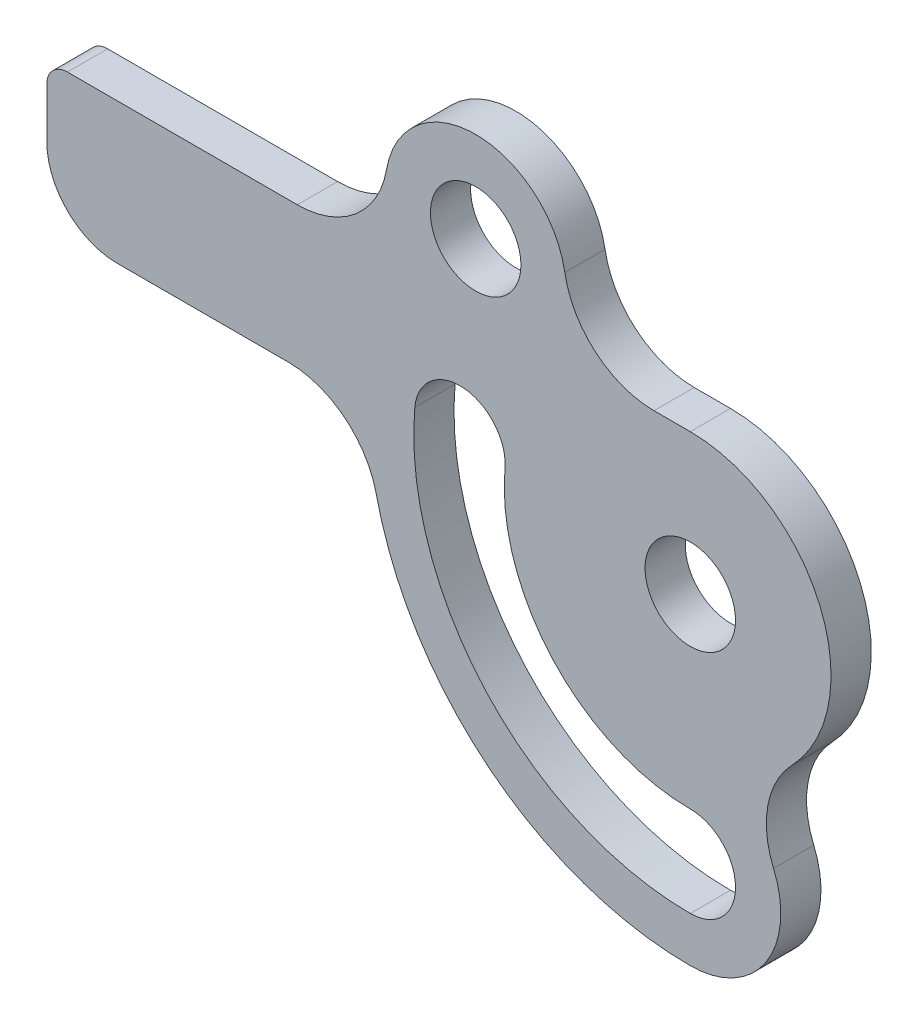
ISO-10303-21;
HEADER;
FILE_DESCRIPTION(('STEP AP214'),'2;1');
FILE_NAME('part.step','',(''),(''),'','','');
FILE_SCHEMA(('AUTOMOTIVE_DESIGN { 1 0 10303 214 1 1 1 1 }'));
ENDSEC;
DATA;
#1=APPLICATION_CONTEXT('core data for automotive mechanical design processes');
#2=APPLICATION_PROTOCOL_DEFINITION('international standard','automotive_design',2000,#1);
#3=PRODUCT_CONTEXT('',#1,'mechanical');
#4=PRODUCT('Part','Part','',(#3));
#5=PRODUCT_RELATED_PRODUCT_CATEGORY('part','',(#4));
#6=PRODUCT_DEFINITION_FORMATION('','',#4);
#7=PRODUCT_DEFINITION_CONTEXT('part definition',#1,'design');
#8=PRODUCT_DEFINITION('design','',#6,#7);
#9=PRODUCT_DEFINITION_SHAPE('','',#8);
#10=(LENGTH_UNIT() NAMED_UNIT(*) SI_UNIT(.MILLI.,.METRE.));
#11=(NAMED_UNIT(*) PLANE_ANGLE_UNIT() SI_UNIT($,.RADIAN.));
#12=(NAMED_UNIT(*) SI_UNIT($,.STERADIAN.) SOLID_ANGLE_UNIT());
#13=UNCERTAINTY_MEASURE_WITH_UNIT(LENGTH_MEASURE(1.E-05),#10,'distance_accuracy_value','');
#14=(GEOMETRIC_REPRESENTATION_CONTEXT(3) GLOBAL_UNCERTAINTY_ASSIGNED_CONTEXT((#13)) GLOBAL_UNIT_ASSIGNED_CONTEXT((#10,
#11,#12)) REPRESENTATION_CONTEXT('',''));
#15=CARTESIAN_POINT('',(0.,0.,0.));
#16=DIRECTION('',(0.,0.,1.));
#17=DIRECTION('',(1.,0.,0.));
#18=AXIS2_PLACEMENT_3D('',#15,#16,#17);
#19=CARTESIAN_POINT('',(25.4,-9.128125,1.5875));
#20=DIRECTION('',(0.,0.,-1.));
#21=DIRECTION('',(-1.,0.,0.));
#22=AXIS2_PLACEMENT_3D('',#19,#20,#21);
#23=CYLINDRICAL_SURFACE('',#22,1.7859375);
#24=CARTESIAN_POINT('',(25.4,-9.128125,0.));
#25=DIRECTION('',(0.,0.,1.));
#26=DIRECTION('',(1.,0.,0.));
#27=AXIS2_PLACEMENT_3D('',#24,#25,#26);
#28=CIRCLE('',#27,1.7859375);
#29=CARTESIAN_POINT('',(25.4,-10.9140625,0.));
#30=VERTEX_POINT('',#29);
#31=CARTESIAN_POINT('',(25.4,-7.34218749999999,0.));
#32=VERTEX_POINT('',#31);
#33=EDGE_CURVE('E283',#30,#32,#28,.T.);
#34=ORIENTED_EDGE('',*,*,#33,.F.);
#35=DIRECTION('',(0.,0.,-1.));
#36=VECTOR('',#35,1.);
#37=CARTESIAN_POINT('',(25.4,-10.9140625,1.5875));
#38=LINE('',#37,#36);
#39=CARTESIAN_POINT('',(25.4,-10.9140625,1.5875));
#40=VERTEX_POINT('',#39);
#41=EDGE_CURVE('E306',#40,#30,#38,.T.);
#42=ORIENTED_EDGE('',*,*,#41,.F.);
#43=CARTESIAN_POINT('',(25.4,-9.128125,1.5875));
#44=DIRECTION('',(0.,0.,1.));
#45=DIRECTION('',(1.,0.,0.));
#46=AXIS2_PLACEMENT_3D('',#43,#44,#45);
#47=CIRCLE('',#46,1.7859375);
#48=CARTESIAN_POINT('',(25.4,-7.34218749999999,1.5875));
#49=VERTEX_POINT('',#48);
#50=EDGE_CURVE('E229',#40,#49,#47,.T.);
#51=ORIENTED_EDGE('',*,*,#50,.T.);
#52=DIRECTION('',(0.,0.,-1.));
#53=VECTOR('',#52,1.);
#54=CARTESIAN_POINT('',(25.4,-7.34218749999999,1.5875));
#55=LINE('',#54,#53);
#56=EDGE_CURVE('E180',#49,#32,#55,.T.);
#57=ORIENTED_EDGE('',*,*,#56,.T.);
#58=EDGE_LOOP('',(#34,#42,#51,#57));
#59=FACE_BOUND('',#58,.T.);
#60=ADVANCED_FACE('F41',(#59),#23,.F.);
#61=CARTESIAN_POINT('',(25.4,0.,1.5875));
#62=DIRECTION('',(0.,0.,-1.));
#63=DIRECTION('',(-1.,0.,0.));
#64=AXIS2_PLACEMENT_3D('',#61,#62,#63);
#65=CYLINDRICAL_SURFACE('',#64,10.9140625);
#66=CARTESIAN_POINT('',(25.4,0.,0.));
#67=DIRECTION('',(0.,0.,1.));
#68=DIRECTION('',(1.,0.,0.));
#69=AXIS2_PLACEMENT_3D('',#66,#67,#68);
#70=CIRCLE('',#69,10.9140625);
#71=CARTESIAN_POINT('',(14.5274688028581,0.951223223581812,0.));
#72=VERTEX_POINT('',#71);
#73=EDGE_CURVE('E287',#30,#72,#70,.F.);
#74=ORIENTED_EDGE('',*,*,#73,.T.);
#75=DIRECTION('',(0.,0.,-1.));
#76=VECTOR('',#75,1.);
#77=CARTESIAN_POINT('',(14.5274688028581,0.951223223581812,1.5875));
#78=LINE('',#77,#76);
#79=CARTESIAN_POINT('',(14.5274688028581,0.951223223581812,1.5875));
#80=VERTEX_POINT('',#79);
#81=EDGE_CURVE('E303',#80,#72,#78,.T.);
#82=ORIENTED_EDGE('',*,*,#81,.F.);
#83=CARTESIAN_POINT('',(25.4,0.,1.5875));
#84=DIRECTION('',(0.,0.,1.));
#85=DIRECTION('',(1.,0.,0.));
#86=AXIS2_PLACEMENT_3D('',#83,#84,#85);
#87=CIRCLE('',#86,10.9140625);
#88=EDGE_CURVE('E233',#40,#80,#87,.F.);
#89=ORIENTED_EDGE('',*,*,#88,.F.);
#90=ORIENTED_EDGE('',*,*,#41,.T.);
#91=EDGE_LOOP('',(#74,#82,#89,#90));
#92=FACE_BOUND('',#91,.T.);
#93=ADVANCED_FACE('F387',(#92),#65,.F.);
#94=CARTESIAN_POINT('',(16.3066102714813,0.795568514268424,1.5875));
#95=DIRECTION('',(0.,0.,-1.));
#96=DIRECTION('',(-1.,0.,0.));
#97=AXIS2_PLACEMENT_3D('',#94,#95,#96);
#98=CYLINDRICAL_SURFACE('',#97,1.78593749999999);
#99=CARTESIAN_POINT('',(16.3066102714813,0.795568514268424,0.));
#100=DIRECTION('',(0.,0.,1.));
#101=DIRECTION('',(1.,0.,0.));
#102=AXIS2_PLACEMENT_3D('',#99,#100,#101);
#103=CIRCLE('',#102,1.78593749999999);
#104=CARTESIAN_POINT('',(18.0857517401045,0.639913804955036,0.));
#105=VERTEX_POINT('',#104);
#106=EDGE_CURVE('E291',#105,#72,#103,.T.);
#107=ORIENTED_EDGE('',*,*,#106,.F.);
#108=DIRECTION('',(0.,0.,-1.));
#109=VECTOR('',#108,1.);
#110=CARTESIAN_POINT('',(18.0857517401045,0.639913804955036,1.5875));
#111=LINE('',#110,#109);
#112=CARTESIAN_POINT('',(18.0857517401045,0.639913804955036,1.5875));
#113=VERTEX_POINT('',#112);
#114=EDGE_CURVE('E300',#113,#105,#111,.T.);
#115=ORIENTED_EDGE('',*,*,#114,.F.);
#116=CARTESIAN_POINT('',(16.3066102714813,0.795568514268424,1.5875));
#117=DIRECTION('',(0.,0.,1.));
#118=DIRECTION('',(1.,0.,0.));
#119=AXIS2_PLACEMENT_3D('',#116,#117,#118);
#120=CIRCLE('',#119,1.78593749999999);
#121=EDGE_CURVE('E236',#113,#80,#120,.T.);
#122=ORIENTED_EDGE('',*,*,#121,.T.);
#123=ORIENTED_EDGE('',*,*,#81,.T.);
#124=EDGE_LOOP('',(#107,#115,#122,#123));
#125=FACE_BOUND('',#124,.T.);
#126=ADVANCED_FACE('F393',(#125),#98,.F.);
#127=CARTESIAN_POINT('',(0.,5.55625,1.5875));
#128=DIRECTION('',(0.,1.,0.));
#129=DIRECTION('',(0.,0.,1.));
#130=AXIS2_PLACEMENT_3D('',#127,#128,#129);
#131=PLANE('',#130);
#132=DIRECTION('',(1.,0.,0.));
#133=VECTOR('',#132,1.);
#134=CARTESIAN_POINT('',(0.,5.55625,1.5875));
#135=LINE('',#134,#133);
#136=CARTESIAN_POINT('',(0.813693973516123,5.55625,1.5875));
#137=VERTEX_POINT('',#136);
#138=CARTESIAN_POINT('',(9.88973119369293,5.55625,1.5875));
#139=VERTEX_POINT('',#138);
#140=EDGE_CURVE('E172',#137,#139,#135,.T.);
#141=ORIENTED_EDGE('',*,*,#140,.T.);
#142=DIRECTION('',(0.,0.,-1.));
#143=VECTOR('',#142,1.);
#144=CARTESIAN_POINT('',(9.88973119369293,5.55625,1.5875));
#145=LINE('',#144,#143);
#146=CARTESIAN_POINT('',(9.88973119369293,5.55625,0.));
#147=VERTEX_POINT('',#146);
#148=EDGE_CURVE('E340',#139,#147,#145,.T.);
#149=ORIENTED_EDGE('',*,*,#148,.T.);
#150=DIRECTION('',(1.,0.,0.));
#151=VECTOR('',#150,1.);
#152=CARTESIAN_POINT('',(0.,5.55625,0.));
#153=LINE('',#152,#151);
#154=CARTESIAN_POINT('',(0.813693973516123,5.55625,0.));
#155=VERTEX_POINT('',#154);
#156=EDGE_CURVE('E175',#155,#147,#153,.T.);
#157=ORIENTED_EDGE('',*,*,#156,.F.);
#158=DIRECTION('',(0.,0.,-1.));
#159=VECTOR('',#158,1.);
#160=CARTESIAN_POINT('',(0.813693973516123,5.55625,1.5875));
#161=LINE('',#160,#159);
#162=EDGE_CURVE('E167',#137,#155,#161,.T.);
#163=ORIENTED_EDGE('',*,*,#162,.F.);
#164=EDGE_LOOP('',(#141,#149,#157,#163));
#165=FACE_BOUND('',#164,.T.);
#166=ADVANCED_FACE('F169',(#165),#131,.T.);
#167=CARTESIAN_POINT('',(0.813693973516123,4.74255602648388,1.5875));
#168=DIRECTION('',(0.,0.,-1.));
#169=DIRECTION('',(-1.,0.,0.));
#170=AXIS2_PLACEMENT_3D('',#167,#168,#169);
#171=CYLINDRICAL_SURFACE('',#170,0.813693973516129);
#172=CARTESIAN_POINT('',(0.813693973516123,4.74255602648388,0.));
#173=DIRECTION('',(0.,0.,1.));
#174=DIRECTION('',(1.,0.,0.));
#175=AXIS2_PLACEMENT_3D('',#172,#173,#174);
#176=CIRCLE('',#175,0.813693973516129);
#177=CARTESIAN_POINT('',(0.,4.74255602648388,0.));
#178=VERTEX_POINT('',#177);
#179=EDGE_CURVE('E250',#155,#178,#176,.T.);
#180=ORIENTED_EDGE('',*,*,#179,.T.);
#181=DIRECTION('',(0.,0.,-1.));
#182=VECTOR('',#181,1.);
#183=CARTESIAN_POINT('',(0.,4.74255602648388,1.5875));
#184=LINE('',#183,#182);
#185=CARTESIAN_POINT('',(0.,4.74255602648388,1.5875));
#186=VERTEX_POINT('',#185);
#187=EDGE_CURVE('E181',#186,#178,#184,.T.);
#188=ORIENTED_EDGE('',*,*,#187,.F.);
#189=CARTESIAN_POINT('',(0.813693973516123,4.74255602648388,1.5875));
#190=DIRECTION('',(0.,0.,1.));
#191=DIRECTION('',(1.,0.,0.));
#192=AXIS2_PLACEMENT_3D('',#189,#190,#191);
#193=CIRCLE('',#192,0.813693973516129);
#194=EDGE_CURVE('E184',#137,#186,#193,.T.);
#195=ORIENTED_EDGE('',*,*,#194,.F.);
#196=ORIENTED_EDGE('',*,*,#162,.T.);
#197=EDGE_LOOP('',(#180,#188,#195,#196));
#198=FACE_BOUND('',#197,.T.);
#199=ADVANCED_FACE('F185',(#198),#171,.T.);
#200=CARTESIAN_POINT('',(0.,0.,1.5875));
#201=DIRECTION('',(-1.,0.,0.));
#202=DIRECTION('',(0.,0.,1.));
#203=AXIS2_PLACEMENT_3D('',#200,#201,#202);
#204=PLANE('',#203);
#205=DIRECTION('',(0.,1.,0.));
#206=VECTOR('',#205,1.);
#207=CARTESIAN_POINT('',(0.,0.,0.));
#208=LINE('',#207,#206);
#209=CARTESIAN_POINT('',(0.,2.778125,0.));
#210=VERTEX_POINT('',#209);
#211=EDGE_CURVE('E254',#210,#178,#208,.T.);
#212=ORIENTED_EDGE('',*,*,#211,.F.);
#213=DIRECTION('',(0.,0.,-1.));
#214=VECTOR('',#213,1.);
#215=CARTESIAN_POINT('',(0.,2.778125,1.5875));
#216=LINE('',#215,#214);
#217=CARTESIAN_POINT('',(0.,2.778125,1.5875));
#218=VERTEX_POINT('',#217);
#219=EDGE_CURVE('E319',#218,#210,#216,.T.);
#220=ORIENTED_EDGE('',*,*,#219,.F.);
#221=DIRECTION('',(0.,1.,0.));
#222=VECTOR('',#221,1.);
#223=CARTESIAN_POINT('',(0.,0.,1.5875));
#224=LINE('',#223,#222);
#225=EDGE_CURVE('E190',#218,#186,#224,.T.);
#226=ORIENTED_EDGE('',*,*,#225,.T.);
#227=ORIENTED_EDGE('',*,*,#187,.T.);
#228=EDGE_LOOP('',(#212,#220,#226,#227));
#229=FACE_BOUND('',#228,.T.);
#230=ADVANCED_FACE('F428',(#229),#204,.T.);
#231=CARTESIAN_POINT('',(2.778125,2.778125,1.5875));
#232=DIRECTION('',(0.,0.,-1.));
#233=DIRECTION('',(-1.,0.,0.));
#234=AXIS2_PLACEMENT_3D('',#231,#232,#233);
#235=CYLINDRICAL_SURFACE('',#234,2.77812499999999);
#236=CARTESIAN_POINT('',(2.778125,2.778125,0.));
#237=DIRECTION('',(0.,0.,1.));
#238=DIRECTION('',(1.,0.,0.));
#239=AXIS2_PLACEMENT_3D('',#236,#237,#238);
#240=CIRCLE('',#239,2.77812499999999);
#241=CARTESIAN_POINT('',(2.778125,0.,0.));
#242=VERTEX_POINT('',#241);
#243=EDGE_CURVE('E258',#210,#242,#240,.T.);
#244=ORIENTED_EDGE('',*,*,#243,.T.);
#245=DIRECTION('',(0.,0.,-1.));
#246=VECTOR('',#245,1.);
#247=CARTESIAN_POINT('',(2.778125,0.,1.5875));
#248=LINE('',#247,#246);
#249=CARTESIAN_POINT('',(2.778125,0.,1.5875));
#250=VERTEX_POINT('',#249);
#251=EDGE_CURVE('E315',#250,#242,#248,.T.);
#252=ORIENTED_EDGE('',*,*,#251,.F.);
#253=CARTESIAN_POINT('',(2.778125,2.778125,1.5875));
#254=DIRECTION('',(0.,0.,1.));
#255=DIRECTION('',(1.,0.,0.));
#256=AXIS2_PLACEMENT_3D('',#253,#254,#255);
#257=CIRCLE('',#256,2.77812499999999);
#258=EDGE_CURVE('E458',#218,#250,#257,.T.);
#259=ORIENTED_EDGE('',*,*,#258,.F.);
#260=ORIENTED_EDGE('',*,*,#219,.T.);
#261=EDGE_LOOP('',(#244,#252,#259,#260));
#262=FACE_BOUND('',#261,.T.);
#263=ADVANCED_FACE('F425',(#262),#235,.T.);
#264=CARTESIAN_POINT('',(0.,0.,1.5875));
#265=DIRECTION('',(0.,1.,0.));
#266=DIRECTION('',(0.,0.,1.));
#267=AXIS2_PLACEMENT_3D('',#264,#265,#266);
#268=PLANE('',#267);
#269=DIRECTION('',(1.,0.,0.));
#270=VECTOR('',#269,1.);
#271=CARTESIAN_POINT('',(0.,0.,0.));
#272=LINE('',#271,#270);
#273=CARTESIAN_POINT('',(9.52500000000001,0.,0.));
#274=VERTEX_POINT('',#273);
#275=EDGE_CURVE('E261',#242,#274,#272,.T.);
#276=ORIENTED_EDGE('',*,*,#275,.T.);
#277=DIRECTION('',(0.,0.,-1.));
#278=VECTOR('',#277,1.);
#279=CARTESIAN_POINT('',(9.52500000000001,0.,1.5875));
#280=LINE('',#279,#278);
#281=CARTESIAN_POINT('',(9.52500000000001,0.,1.5875));
#282=VERTEX_POINT('',#281);
#283=EDGE_CURVE('E57',#274,#282,#280,.F.);
#284=ORIENTED_EDGE('',*,*,#283,.T.);
#285=DIRECTION('',(1.,0.,0.));
#286=VECTOR('',#285,1.);
#287=CARTESIAN_POINT('',(0.,0.,1.5875));
#288=LINE('',#287,#286);
#289=EDGE_CURVE('E456',#250,#282,#288,.T.);
#290=ORIENTED_EDGE('',*,*,#289,.F.);
#291=ORIENTED_EDGE('',*,*,#251,.T.);
#292=EDGE_LOOP('',(#276,#284,#290,#291));
#293=FACE_BOUND('',#292,.T.);
#294=ADVANCED_FACE('F421',(#293),#268,.F.);
#295=CARTESIAN_POINT('',(25.4,0.,1.5875));
#296=DIRECTION('',(0.,0.,-1.));
#297=DIRECTION('',(-1.,0.,0.));
#298=AXIS2_PLACEMENT_3D('',#295,#296,#297);
#299=CYLINDRICAL_SURFACE('',#298,12.7);
#300=CARTESIAN_POINT('',(25.4,0.,1.5875));
#301=DIRECTION('',(0.,0.,1.));
#302=DIRECTION('',(1.,0.,0.));
#303=AXIS2_PLACEMENT_3D('',#300,#301,#302);
#304=CIRCLE('',#303,12.7);
#305=CARTESIAN_POINT('',(25.4,-12.7,1.5875));
#306=VERTEX_POINT('',#305);
#307=CARTESIAN_POINT('',(13.009756097561,-2.78780487804878,1.5875));
#308=VERTEX_POINT('',#307);
#309=EDGE_CURVE('E222',#306,#308,#304,.F.);
#310=ORIENTED_EDGE('',*,*,#309,.T.);
#311=DIRECTION('',(0.,0.,-1.));
#312=VECTOR('',#311,1.);
#313=CARTESIAN_POINT('',(13.009756097561,-2.78780487804878,1.5875));
#314=LINE('',#313,#312);
#315=CARTESIAN_POINT('',(13.009756097561,-2.78780487804878,0.));
#316=VERTEX_POINT('',#315);
#317=EDGE_CURVE('E343',#308,#316,#314,.T.);
#318=ORIENTED_EDGE('',*,*,#317,.T.);
#319=CARTESIAN_POINT('',(25.4,0.,0.));
#320=DIRECTION('',(0.,0.,1.));
#321=DIRECTION('',(1.,0.,0.));
#322=AXIS2_PLACEMENT_3D('',#319,#320,#321);
#323=CIRCLE('',#322,12.7);
#324=CARTESIAN_POINT('',(25.4,-12.7,0.));
#325=VERTEX_POINT('',#324);
#326=EDGE_CURVE('E264',#325,#316,#323,.F.);
#327=ORIENTED_EDGE('',*,*,#326,.F.);
#328=DIRECTION('',(0.,0.,-1.));
#329=VECTOR('',#328,1.);
#330=CARTESIAN_POINT('',(25.4,-12.7,1.5875));
#331=LINE('',#330,#329);
#332=EDGE_CURVE('E312',#306,#325,#331,.T.);
#333=ORIENTED_EDGE('',*,*,#332,.F.);
#334=EDGE_LOOP('',(#310,#318,#327,#333));
#335=FACE_BOUND('',#334,.T.);
#336=ADVANCED_FACE('F417',(#335),#299,.T.);
#337=CARTESIAN_POINT('',(25.4,-9.128125,1.5875));
#338=DIRECTION('',(0.,0.,-1.));
#339=DIRECTION('',(-1.,0.,0.));
#340=AXIS2_PLACEMENT_3D('',#337,#338,#339);
#341=CYLINDRICAL_SURFACE('',#340,3.571875);
#342=CARTESIAN_POINT('',(25.4,-9.128125,0.));
#343=DIRECTION('',(0.,0.,1.));
#344=DIRECTION('',(1.,0.,0.));
#345=AXIS2_PLACEMENT_3D('',#342,#343,#344);
#346=CIRCLE('',#345,3.571875);
#347=CARTESIAN_POINT('',(28.6870584223335,-7.73043478260869,0.));
#348=VERTEX_POINT('',#347);
#349=EDGE_CURVE('E267',#325,#348,#346,.T.);
#350=ORIENTED_EDGE('',*,*,#349,.T.);
#351=DIRECTION('',(0.,0.,-1.));
#352=VECTOR('',#351,1.);
#353=CARTESIAN_POINT('',(28.6870584223335,-7.73043478260869,1.5875));
#354=LINE('',#353,#352);
#355=CARTESIAN_POINT('',(28.6870584223335,-7.73043478260869,1.5875));
#356=VERTEX_POINT('',#355);
#357=EDGE_CURVE('E327',#348,#356,#354,.F.);
#358=ORIENTED_EDGE('',*,*,#357,.T.);
#359=CARTESIAN_POINT('',(25.4,-9.128125,1.5875));
#360=DIRECTION('',(0.,0.,1.));
#361=DIRECTION('',(1.,0.,0.));
#362=AXIS2_PLACEMENT_3D('',#359,#360,#361);
#363=CIRCLE('',#362,3.571875);
#364=EDGE_CURVE('E216',#306,#356,#363,.T.);
#365=ORIENTED_EDGE('',*,*,#364,.F.);
#366=ORIENTED_EDGE('',*,*,#332,.T.);
#367=EDGE_LOOP('',(#350,#358,#365,#366));
#368=FACE_BOUND('',#367,.T.);
#369=ADVANCED_FACE('F413',(#368),#341,.T.);
#370=CARTESIAN_POINT('',(25.4,0.,1.5875));
#371=DIRECTION('',(0.,0.,-1.));
#372=DIRECTION('',(-1.,0.,0.));
#373=AXIS2_PLACEMENT_3D('',#370,#371,#372);
#374=CYLINDRICAL_SURFACE('',#373,5.55625);
#375=CARTESIAN_POINT('',(25.4,0.,1.5875));
#376=DIRECTION('',(0.,0.,1.));
#377=DIRECTION('',(1.,0.,0.));
#378=AXIS2_PLACEMENT_3D('',#375,#376,#377);
#379=CIRCLE('',#378,5.55625);
#380=CARTESIAN_POINT('',(29.4016363402321,-3.85471408317581,1.5875));
#381=VERTEX_POINT('',#380);
#382=CARTESIAN_POINT('',(25.4,5.55625,1.5875));
#383=VERTEX_POINT('',#382);
#384=EDGE_CURVE('E207',#381,#383,#379,.T.);
#385=ORIENTED_EDGE('',*,*,#384,.F.);
#386=DIRECTION('',(0.,0.,-1.));
#387=VECTOR('',#386,1.);
#388=CARTESIAN_POINT('',(29.4016363402321,-3.85471408317581,1.5875));
#389=LINE('',#388,#387);
#390=CARTESIAN_POINT('',(29.4016363402321,-3.85471408317581,0.));
#391=VERTEX_POINT('',#390);
#392=EDGE_CURVE('E309',#381,#391,#389,.T.);
#393=ORIENTED_EDGE('',*,*,#392,.T.);
#394=CARTESIAN_POINT('',(25.4,0.,0.));
#395=DIRECTION('',(0.,0.,1.));
#396=DIRECTION('',(1.,0.,0.));
#397=AXIS2_PLACEMENT_3D('',#394,#395,#396);
#398=CIRCLE('',#397,5.55625);
#399=CARTESIAN_POINT('',(25.4,5.55625,0.));
#400=VERTEX_POINT('',#399);
#401=EDGE_CURVE('E271',#391,#400,#398,.T.);
#402=ORIENTED_EDGE('',*,*,#401,.T.);
#403=DIRECTION('',(0.,0.,-1.));
#404=VECTOR('',#403,1.);
#405=CARTESIAN_POINT('',(25.4,5.55625,1.5875));
#406=LINE('',#405,#404);
#407=EDGE_CURVE('E247',#383,#400,#406,.T.);
#408=ORIENTED_EDGE('',*,*,#407,.F.);
#409=EDGE_LOOP('',(#385,#393,#402,#408));
#410=FACE_BOUND('',#409,.T.);
#411=ADVANCED_FACE('F410',(#410),#374,.T.);
#412=CARTESIAN_POINT('',(23.9687270237767,5.55625,0.));
#413=VERTEX_POINT('',#412);
#414=EDGE_CURVE('E251',#413,#400,#153,.T.);
#415=ORIENTED_EDGE('',*,*,#414,.F.);
#416=DIRECTION('',(0.,0.,-1.));
#417=VECTOR('',#416,1.);
#418=CARTESIAN_POINT('',(23.9687270237767,5.55625,1.5875));
#419=LINE('',#418,#417);
#420=CARTESIAN_POINT('',(23.9687270237767,5.55625,1.5875));
#421=VERTEX_POINT('',#420);
#422=EDGE_CURVE('E337',#413,#421,#419,.F.);
#423=ORIENTED_EDGE('',*,*,#422,.T.);
#424=EDGE_CURVE('E200',#421,#383,#135,.T.);
#425=ORIENTED_EDGE('',*,*,#424,.T.);
#426=ORIENTED_EDGE('',*,*,#407,.T.);
#427=EDGE_LOOP('',(#415,#423,#425,#426));
#428=FACE_BOUND('',#427,.T.);
#429=ADVANCED_FACE('F407',(#428),#131,.T.);
#430=CARTESIAN_POINT('',(25.4,0.,1.5875));
#431=DIRECTION('',(0.,0.,-1.));
#432=DIRECTION('',(-1.,0.,0.));
#433=AXIS2_PLACEMENT_3D('',#430,#431,#432);
#434=CYLINDRICAL_SURFACE('',#433,7.34218749999999);
#435=CARTESIAN_POINT('',(25.4,0.,0.));
#436=DIRECTION('',(0.,0.,1.));
#437=DIRECTION('',(1.,0.,0.));
#438=AXIS2_PLACEMENT_3D('',#435,#436,#437);
#439=CIRCLE('',#438,7.34218749999999);
#440=EDGE_CURVE('E203',#105,#32,#439,.T.);
#441=ORIENTED_EDGE('',*,*,#440,.T.);
#442=ORIENTED_EDGE('',*,*,#56,.F.);
#443=CARTESIAN_POINT('',(25.4,0.,1.5875));
#444=DIRECTION('',(0.,0.,1.));
#445=DIRECTION('',(1.,0.,0.));
#446=AXIS2_PLACEMENT_3D('',#443,#444,#445);
#447=CIRCLE('',#446,7.34218749999999);
#448=EDGE_CURVE('E240',#113,#49,#447,.T.);
#449=ORIENTED_EDGE('',*,*,#448,.F.);
#450=ORIENTED_EDGE('',*,*,#114,.T.);
#451=EDGE_LOOP('',(#441,#442,#449,#450));
#452=FACE_BOUND('',#451,.T.);
#453=ADVANCED_FACE('F402',(#452),#434,.T.);
#454=CARTESIAN_POINT('',(25.4,0.,1.5875));
#455=DIRECTION('',(0.,0.,-1.));
#456=DIRECTION('',(-1.,0.,0.));
#457=AXIS2_PLACEMENT_3D('',#454,#455,#456);
#458=CYLINDRICAL_SURFACE('',#457,1.7859375);
#459=CARTESIAN_POINT('',(25.4,0.,1.5875));
#460=DIRECTION('',(0.,0.,1.));
#461=DIRECTION('',(1.,0.,0.));
#462=AXIS2_PLACEMENT_3D('',#459,#460,#461);
#463=CIRCLE('',#462,1.7859375);
#464=CARTESIAN_POINT('',(27.1859375,0.,1.5875));
#465=VERTEX_POINT('',#464);
#466=EDGE_CURVE('E214',#465,#465,#463,.T.);
#467=ORIENTED_EDGE('',*,*,#466,.T.);
#468=EDGE_LOOP('',(#467));
#469=FACE_BOUND('',#468,.T.);
#470=CARTESIAN_POINT('',(25.4,0.,0.));
#471=DIRECTION('',(0.,0.,1.));
#472=DIRECTION('',(1.,0.,0.));
#473=AXIS2_PLACEMENT_3D('',#470,#471,#472);
#474=CIRCLE('',#473,1.7859375);
#475=CARTESIAN_POINT('',(27.1859375,0.,0.));
#476=VERTEX_POINT('',#475);
#477=EDGE_CURVE('E279',#476,#476,#474,.T.);
#478=ORIENTED_EDGE('',*,*,#477,.F.);
#479=EDGE_LOOP('',(#478));
#480=FACE_BOUND('',#479,.T.);
#481=ADVANCED_FACE('F399',(#469,#480),#458,.F.);
#482=CARTESIAN_POINT('',(16.9292291087348,7.91213438876133,1.5875));
#483=DIRECTION('',(0.,0.,-1.));
#484=DIRECTION('',(-1.,0.,0.));
#485=AXIS2_PLACEMENT_3D('',#482,#483,#484);
#486=CYLINDRICAL_SURFACE('',#485,3.571875);
#487=CARTESIAN_POINT('',(16.9292291087348,7.91213438876133,1.5875));
#488=DIRECTION('',(0.,0.,1.));
#489=DIRECTION('',(1.,0.,0.));
#490=AXIS2_PLACEMENT_3D('',#487,#488,#489);
#491=CIRCLE('',#490,3.571875);
#492=CARTESIAN_POINT('',(20.4489780662558,8.52012969438066,1.5875));
#493=VERTEX_POINT('',#492);
#494=CARTESIAN_POINT('',(13.4094801512139,8.52012969438066,1.5875));
#495=VERTEX_POINT('',#494);
#496=EDGE_CURVE('E206',#493,#495,#491,.T.);
#497=ORIENTED_EDGE('',*,*,#496,.F.);
#498=DIRECTION('',(0.,0.,-1.));
#499=VECTOR('',#498,1.);
#500=CARTESIAN_POINT('',(20.4489780662558,8.52012969438066,1.5875));
#501=LINE('',#500,#499);
#502=CARTESIAN_POINT('',(20.4489780662558,8.52012969438066,0.));
#503=VERTEX_POINT('',#502);
#504=EDGE_CURVE('E333',#493,#503,#501,.T.);
#505=ORIENTED_EDGE('',*,*,#504,.T.);
#506=CARTESIAN_POINT('',(16.9292291087348,7.91213438876133,0.));
#507=DIRECTION('',(0.,0.,1.));
#508=DIRECTION('',(1.,0.,0.));
#509=AXIS2_PLACEMENT_3D('',#506,#507,#508);
#510=CIRCLE('',#509,3.571875);
#511=CARTESIAN_POINT('',(13.4094801512139,8.52012969438066,0.));
#512=VERTEX_POINT('',#511);
#513=EDGE_CURVE('E275',#503,#512,#510,.T.);
#514=ORIENTED_EDGE('',*,*,#513,.T.);
#515=DIRECTION('',(0.,0.,-1.));
#516=VECTOR('',#515,1.);
#517=CARTESIAN_POINT('',(13.4094801512139,8.52012969438066,1.5875));
#518=LINE('',#517,#516);
#519=EDGE_CURVE('E330',#512,#495,#518,.F.);
#520=ORIENTED_EDGE('',*,*,#519,.T.);
#521=EDGE_LOOP('',(#497,#505,#514,#520));
#522=FACE_BOUND('',#521,.T.);
#523=ADVANCED_FACE('F373',(#522),#486,.T.);
#524=CARTESIAN_POINT('',(16.9292291087348,7.91213438876133,1.5875));
#525=DIRECTION('',(0.,0.,-1.));
#526=DIRECTION('',(-1.,0.,0.));
#527=AXIS2_PLACEMENT_3D('',#524,#525,#526);
#528=CYLINDRICAL_SURFACE('',#527,1.78593749999999);
#529=CARTESIAN_POINT('',(16.9292291087348,7.91213438876133,1.5875));
#530=DIRECTION('',(0.,0.,1.));
#531=DIRECTION('',(1.,0.,0.));
#532=AXIS2_PLACEMENT_3D('',#529,#530,#531);
#533=CIRCLE('',#532,1.78593749999999);
#534=CARTESIAN_POINT('',(18.7151666087348,7.91213438876133,1.5875));
#535=VERTEX_POINT('',#534);
#536=EDGE_CURVE('E243',#535,#535,#533,.T.);
#537=ORIENTED_EDGE('',*,*,#536,.T.);
#538=EDGE_LOOP('',(#537));
#539=FACE_BOUND('',#538,.T.);
#540=CARTESIAN_POINT('',(16.9292291087348,7.91213438876133,0.));
#541=DIRECTION('',(0.,0.,1.));
#542=DIRECTION('',(1.,0.,0.));
#543=AXIS2_PLACEMENT_3D('',#540,#541,#542);
#544=CIRCLE('',#543,1.78593749999999);
#545=CARTESIAN_POINT('',(18.7151666087348,7.91213438876133,0.));
#546=VERTEX_POINT('',#545);
#547=EDGE_CURVE('E198',#546,#546,#544,.T.);
#548=ORIENTED_EDGE('',*,*,#547,.F.);
#549=EDGE_LOOP('',(#548));
#550=FACE_BOUND('',#549,.T.);
#551=ADVANCED_FACE('F406',(#539,#550),#528,.F.);
#552=CARTESIAN_POINT('',(0.,0.,1.5875));
#553=DIRECTION('',(0.,0.,1.));
#554=DIRECTION('',(1.,0.,0.));
#555=AXIS2_PLACEMENT_3D('',#552,#553,#554);
#556=PLANE('',#555);
#557=ORIENTED_EDGE('',*,*,#140,.F.);
#558=ORIENTED_EDGE('',*,*,#194,.T.);
#559=ORIENTED_EDGE('',*,*,#225,.F.);
#560=ORIENTED_EDGE('',*,*,#258,.T.);
#561=ORIENTED_EDGE('',*,*,#289,.T.);
#562=CARTESIAN_POINT('',(9.52500000000001,-3.571875,1.5875));
#563=DIRECTION('',(0.,0.,1.));
#564=DIRECTION('',(1.,0.,0.));
#565=AXIS2_PLACEMENT_3D('',#562,#563,#564);
#566=CIRCLE('',#565,3.571875);
#567=EDGE_CURVE('E11',#282,#308,#566,.F.);
#568=ORIENTED_EDGE('',*,*,#567,.T.);
#569=ORIENTED_EDGE('',*,*,#309,.F.);
#570=ORIENTED_EDGE('',*,*,#364,.T.);
#571=CARTESIAN_POINT('',(31.974116844667,-6.33274456521739,1.5875));
#572=DIRECTION('',(0.,0.,1.));
#573=DIRECTION('',(1.,0.,0.));
#574=AXIS2_PLACEMENT_3D('',#571,#572,#573);
#575=CIRCLE('',#574,3.571875);
#576=EDGE_CURVE('E352',#356,#381,#575,.F.);
#577=ORIENTED_EDGE('',*,*,#576,.T.);
#578=ORIENTED_EDGE('',*,*,#384,.T.);
#579=ORIENTED_EDGE('',*,*,#424,.F.);
#580=CARTESIAN_POINT('',(23.9687270237767,9.128125,1.5875));
#581=DIRECTION('',(0.,0.,1.));
#582=DIRECTION('',(1.,0.,0.));
#583=AXIS2_PLACEMENT_3D('',#580,#581,#582);
#584=CIRCLE('',#583,3.571875);
#585=EDGE_CURVE('E358',#421,#493,#584,.F.);
#586=ORIENTED_EDGE('',*,*,#585,.T.);
#587=ORIENTED_EDGE('',*,*,#496,.T.);
#588=CARTESIAN_POINT('',(9.88973119369293,9.128125,1.5875));
#589=DIRECTION('',(0.,0.,1.));
#590=DIRECTION('',(1.,0.,0.));
#591=AXIS2_PLACEMENT_3D('',#588,#589,#590);
#592=CIRCLE('',#591,3.571875);
#593=EDGE_CURVE('E196',#495,#139,#592,.F.);
#594=ORIENTED_EDGE('',*,*,#593,.T.);
#595=EDGE_LOOP('',(#557,#558,#559,#560,#561,#568,#569,#570,#577,#578,#579,#586,#587,#594));
#596=FACE_BOUND('',#595,.T.);
#597=ORIENTED_EDGE('',*,*,#466,.F.);
#598=EDGE_LOOP('',(#597));
#599=FACE_BOUND('',#598,.T.);
#600=ORIENTED_EDGE('',*,*,#50,.F.);
#601=ORIENTED_EDGE('',*,*,#88,.T.);
#602=ORIENTED_EDGE('',*,*,#121,.F.);
#603=ORIENTED_EDGE('',*,*,#448,.T.);
#604=EDGE_LOOP('',(#600,#601,#602,#603));
#605=FACE_BOUND('',#604,.T.);
#606=ORIENTED_EDGE('',*,*,#536,.F.);
#607=EDGE_LOOP('',(#606));
#608=FACE_BOUND('',#607,.T.);
#609=ADVANCED_FACE('F192',(#596,#599,#605,#608),#556,.T.);
#610=CARTESIAN_POINT('',(0.,0.,0.));
#611=DIRECTION('',(0.,0.,1.));
#612=DIRECTION('',(1.,0.,0.));
#613=AXIS2_PLACEMENT_3D('',#610,#611,#612);
#614=PLANE('',#613);
#615=ORIENTED_EDGE('',*,*,#156,.T.);
#616=CARTESIAN_POINT('',(9.88973119369293,9.128125,0.));
#617=DIRECTION('',(0.,0.,1.));
#618=DIRECTION('',(1.,0.,0.));
#619=AXIS2_PLACEMENT_3D('',#616,#617,#618);
#620=CIRCLE('',#619,3.571875);
#621=EDGE_CURVE('E361',#147,#512,#620,.T.);
#622=ORIENTED_EDGE('',*,*,#621,.T.);
#623=ORIENTED_EDGE('',*,*,#513,.F.);
#624=CARTESIAN_POINT('',(23.9687270237767,9.128125,0.));
#625=DIRECTION('',(0.,0.,1.));
#626=DIRECTION('',(1.,0.,0.));
#627=AXIS2_PLACEMENT_3D('',#624,#625,#626);
#628=CIRCLE('',#627,3.571875);
#629=EDGE_CURVE('E355',#503,#413,#628,.T.);
#630=ORIENTED_EDGE('',*,*,#629,.T.);
#631=ORIENTED_EDGE('',*,*,#414,.T.);
#632=ORIENTED_EDGE('',*,*,#401,.F.);
#633=CARTESIAN_POINT('',(31.974116844667,-6.33274456521739,0.));
#634=DIRECTION('',(0.,0.,1.));
#635=DIRECTION('',(1.,0.,0.));
#636=AXIS2_PLACEMENT_3D('',#633,#634,#635);
#637=CIRCLE('',#636,3.571875);
#638=EDGE_CURVE('E349',#391,#348,#637,.T.);
#639=ORIENTED_EDGE('',*,*,#638,.T.);
#640=ORIENTED_EDGE('',*,*,#349,.F.);
#641=ORIENTED_EDGE('',*,*,#326,.T.);
#642=CARTESIAN_POINT('',(9.52500000000001,-3.571875,0.));
#643=DIRECTION('',(0.,0.,1.));
#644=DIRECTION('',(1.,0.,0.));
#645=AXIS2_PLACEMENT_3D('',#642,#643,#644);
#646=CIRCLE('',#645,3.571875);
#647=EDGE_CURVE('E50',#316,#274,#646,.T.);
#648=ORIENTED_EDGE('',*,*,#647,.T.);
#649=ORIENTED_EDGE('',*,*,#275,.F.);
#650=ORIENTED_EDGE('',*,*,#243,.F.);
#651=ORIENTED_EDGE('',*,*,#211,.T.);
#652=ORIENTED_EDGE('',*,*,#179,.F.);
#653=EDGE_LOOP('',(#615,#622,#623,#630,#631,#632,#639,#640,#641,#648,#649,#650,#651,#652));
#654=FACE_BOUND('',#653,.T.);
#655=ORIENTED_EDGE('',*,*,#477,.T.);
#656=EDGE_LOOP('',(#655));
#657=FACE_BOUND('',#656,.T.);
#658=ORIENTED_EDGE('',*,*,#33,.T.);
#659=ORIENTED_EDGE('',*,*,#440,.F.);
#660=ORIENTED_EDGE('',*,*,#106,.T.);
#661=ORIENTED_EDGE('',*,*,#73,.F.);
#662=EDGE_LOOP('',(#658,#659,#660,#661));
#663=FACE_BOUND('',#662,.T.);
#664=ORIENTED_EDGE('',*,*,#547,.T.);
#665=EDGE_LOOP('',(#664));
#666=FACE_BOUND('',#665,.T.);
#667=ADVANCED_FACE('F367',(#654,#657,#663,#666),#614,.F.);
#668=CARTESIAN_POINT('',(31.974116844667,-6.33274456521739,1.5875));
#669=DIRECTION('',(0.,0.,1.));
#670=DIRECTION('',(1.,0.,0.));
#671=AXIS2_PLACEMENT_3D('',#668,#669,#670);
#672=CYLINDRICAL_SURFACE('',#671,3.571875);
#673=ORIENTED_EDGE('',*,*,#576,.F.);
#674=ORIENTED_EDGE('',*,*,#357,.F.);
#675=ORIENTED_EDGE('',*,*,#638,.F.);
#676=ORIENTED_EDGE('',*,*,#392,.F.);
#677=EDGE_LOOP('',(#673,#674,#675,#676));
#678=FACE_BOUND('',#677,.T.);
#679=ADVANCED_FACE('F383',(#678),#672,.F.);
#680=CARTESIAN_POINT('',(23.9687270237767,9.128125,1.5875));
#681=DIRECTION('',(0.,0.,-1.));
#682=DIRECTION('',(-1.,0.,0.));
#683=AXIS2_PLACEMENT_3D('',#680,#681,#682);
#684=CYLINDRICAL_SURFACE('',#683,3.571875);
#685=ORIENTED_EDGE('',*,*,#585,.F.);
#686=ORIENTED_EDGE('',*,*,#422,.F.);
#687=ORIENTED_EDGE('',*,*,#629,.F.);
#688=ORIENTED_EDGE('',*,*,#504,.F.);
#689=EDGE_LOOP('',(#685,#686,#687,#688));
#690=FACE_BOUND('',#689,.T.);
#691=ADVANCED_FACE('F377',(#690),#684,.F.);
#692=CARTESIAN_POINT('',(9.88973119369293,9.128125,1.5875));
#693=DIRECTION('',(0.,0.,-1.));
#694=DIRECTION('',(-1.,0.,0.));
#695=AXIS2_PLACEMENT_3D('',#692,#693,#694);
#696=CYLINDRICAL_SURFACE('',#695,3.571875);
#697=ORIENTED_EDGE('',*,*,#593,.F.);
#698=ORIENTED_EDGE('',*,*,#519,.F.);
#699=ORIENTED_EDGE('',*,*,#621,.F.);
#700=ORIENTED_EDGE('',*,*,#148,.F.);
#701=EDGE_LOOP('',(#697,#698,#699,#700));
#702=FACE_BOUND('',#701,.T.);
#703=ADVANCED_FACE('F375',(#702),#696,.F.);
#704=CARTESIAN_POINT('',(9.52500000000001,-3.571875,1.5875));
#705=DIRECTION('',(0.,0.,-1.));
#706=DIRECTION('',(-1.,0.,0.));
#707=AXIS2_PLACEMENT_3D('',#704,#705,#706);
#708=CYLINDRICAL_SURFACE('',#707,3.571875);
#709=ORIENTED_EDGE('',*,*,#567,.F.);
#710=ORIENTED_EDGE('',*,*,#283,.F.);
#711=ORIENTED_EDGE('',*,*,#647,.F.);
#712=ORIENTED_EDGE('',*,*,#317,.F.);
#713=EDGE_LOOP('',(#709,#710,#711,#712));
#714=FACE_BOUND('',#713,.T.);
#715=ADVANCED_FACE('F43',(#714),#708,.F.);
#716=CLOSED_SHELL('',(#60,#93,#126,#166,#199,#230,#263,#294,#336,#369,#411,#429,#453,#481,#523,
#551,#609,#667,#679,#691,#703,#715));
#717=MANIFOLD_SOLID_BREP('B2',#716);
#718=ADVANCED_BREP_SHAPE_REPRESENTATION('',(#18,#717),#14);
#719=SHAPE_DEFINITION_REPRESENTATION(#9,#718);
ENDSEC;
END-ISO-10303-21;
